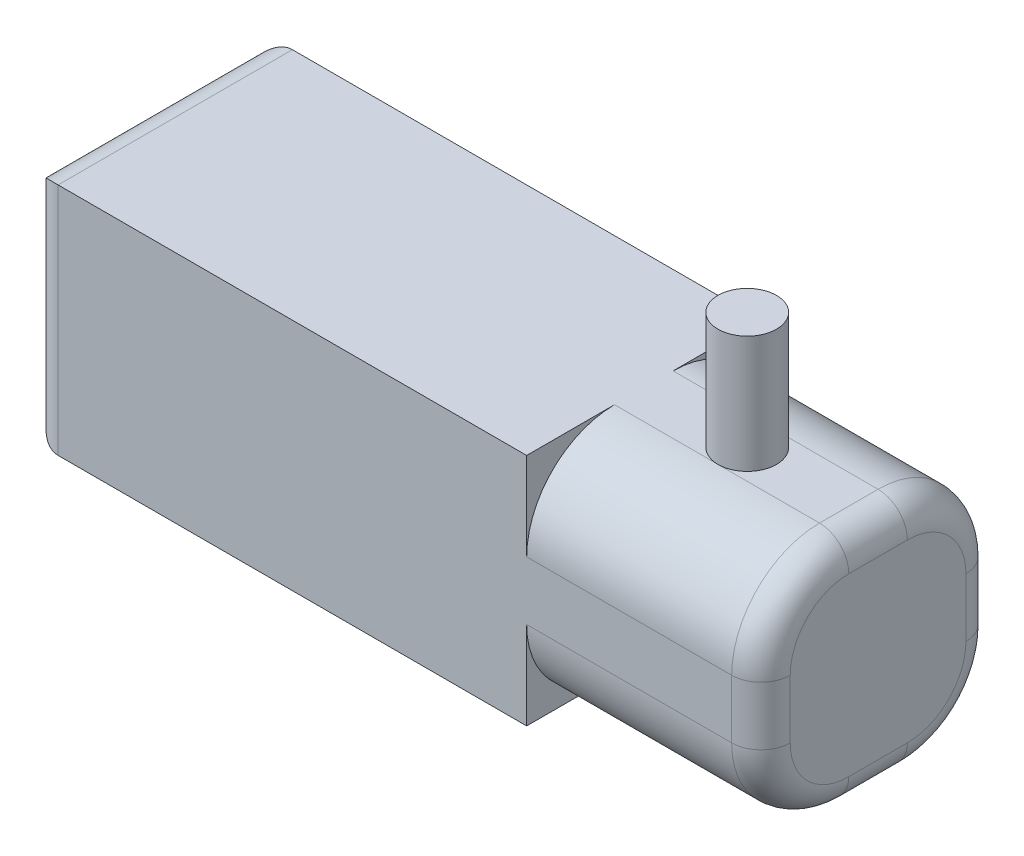
ISO-10303-21;
HEADER;
FILE_DESCRIPTION(('STEP AP214'),'2;1');
FILE_NAME('part.step','',(''),(''),'','','');
FILE_SCHEMA(('AUTOMOTIVE_DESIGN { 1 0 10303 214 1 1 1 1 }'));
ENDSEC;
DATA;
#1=APPLICATION_CONTEXT('core data for automotive mechanical design processes');
#2=APPLICATION_PROTOCOL_DEFINITION('international standard','automotive_design',2000,#1);
#3=PRODUCT_CONTEXT('',#1,'mechanical');
#4=PRODUCT('Part','Part','',(#3));
#5=PRODUCT_RELATED_PRODUCT_CATEGORY('part','',(#4));
#6=PRODUCT_DEFINITION_FORMATION('','',#4);
#7=PRODUCT_DEFINITION_CONTEXT('part definition',#1,'design');
#8=PRODUCT_DEFINITION('design','',#6,#7);
#9=PRODUCT_DEFINITION_SHAPE('','',#8);
#10=(LENGTH_UNIT() NAMED_UNIT(*) SI_UNIT(.MILLI.,.METRE.));
#11=(NAMED_UNIT(*) PLANE_ANGLE_UNIT() SI_UNIT($,.RADIAN.));
#12=(NAMED_UNIT(*) SI_UNIT($,.STERADIAN.) SOLID_ANGLE_UNIT());
#13=UNCERTAINTY_MEASURE_WITH_UNIT(LENGTH_MEASURE(1.E-05),#10,'distance_accuracy_value','');
#14=(GEOMETRIC_REPRESENTATION_CONTEXT(3) GLOBAL_UNCERTAINTY_ASSIGNED_CONTEXT((#13)) GLOBAL_UNIT_ASSIGNED_CONTEXT((#10,
#11,#12)) REPRESENTATION_CONTEXT('',''));
#15=CARTESIAN_POINT('',(0.,0.,0.));
#16=DIRECTION('',(0.,0.,1.));
#17=DIRECTION('',(1.,0.,0.));
#18=AXIS2_PLACEMENT_3D('',#15,#16,#17);
#19=CARTESIAN_POINT('',(20.4017152995501,25.4,10.16));
#20=DIRECTION('',(0.,-1.,0.));
#21=DIRECTION('',(0.,0.,-1.));
#22=AXIS2_PLACEMENT_3D('',#19,#20,#21);
#23=CYLINDRICAL_SURFACE('',#22,2.53999999999995);
#24=CARTESIAN_POINT('',(20.4017152995501,10.16,10.16));
#25=DIRECTION('',(0.,1.,0.));
#26=DIRECTION('',(0.,0.,1.));
#27=AXIS2_PLACEMENT_3D('',#24,#25,#26);
#28=CIRCLE('',#27,2.53999999999995);
#29=CARTESIAN_POINT('',(20.4017152995501,10.16,12.6999999999999));
#30=VERTEX_POINT('',#29);
#31=CARTESIAN_POINT('',(20.4017152995501,10.16,7.62));
#32=VERTEX_POINT('',#31);
#33=EDGE_CURVE('E190',#30,#32,#28,.T.);
#34=ORIENTED_EDGE('',*,*,#33,.T.);
#35=EDGE_CURVE('E197',#32,#30,#28,.T.);
#36=ORIENTED_EDGE('',*,*,#35,.T.);
#37=EDGE_LOOP('',(#34,#36));
#38=FACE_BOUND('',#37,.T.);
#39=CARTESIAN_POINT('',(20.4017152995501,20.32,10.16));
#40=DIRECTION('',(0.,1.,0.));
#41=DIRECTION('',(0.,0.,1.));
#42=AXIS2_PLACEMENT_3D('',#39,#40,#41);
#43=CIRCLE('',#42,2.53999999999995);
#44=CARTESIAN_POINT('',(20.4017152995501,20.32,12.6999999999999));
#45=VERTEX_POINT('',#44);
#46=EDGE_CURVE('E210',#45,#45,#43,.T.);
#47=ORIENTED_EDGE('',*,*,#46,.F.);
#48=EDGE_LOOP('',(#47));
#49=FACE_BOUND('',#48,.T.);
#50=ADVANCED_FACE('F42',(#38,#49),#23,.T.);
#51=CARTESIAN_POINT('',(-31.75,10.16,20.32));
#52=DIRECTION('',(0.,-1.,0.));
#53=DIRECTION('',(0.,0.,-1.));
#54=AXIS2_PLACEMENT_3D('',#51,#52,#53);
#55=PLANE('',#54);
#56=DIRECTION('',(-1.,0.,0.));
#57=VECTOR('',#56,1.);
#58=CARTESIAN_POINT('',(-31.75,10.16,0.));
#59=LINE('',#58,#57);
#60=CARTESIAN_POINT('',(11.43,10.16,0.));
#61=VERTEX_POINT('',#60);
#62=CARTESIAN_POINT('',(-29.21,10.16,0.));
#63=VERTEX_POINT('',#62);
#64=EDGE_CURVE('E259',#61,#63,#59,.T.);
#65=ORIENTED_EDGE('',*,*,#64,.T.);
#66=DIRECTION('',(0.,0.,-1.));
#67=VECTOR('',#66,1.);
#68=CARTESIAN_POINT('',(-29.21,10.16,20.32));
#69=LINE('',#68,#67);
#70=CARTESIAN_POINT('',(-29.21,10.16,20.32));
#71=VERTEX_POINT('',#70);
#72=EDGE_CURVE('E328',#63,#71,#69,.F.);
#73=ORIENTED_EDGE('',*,*,#72,.T.);
#74=DIRECTION('',(-1.,0.,0.));
#75=VECTOR('',#74,1.);
#76=CARTESIAN_POINT('',(-31.75,10.16,20.32));
#77=LINE('',#76,#75);
#78=CARTESIAN_POINT('',(11.43,10.16,20.32));
#79=VERTEX_POINT('',#78);
#80=EDGE_CURVE('E261',#79,#71,#77,.T.);
#81=ORIENTED_EDGE('',*,*,#80,.F.);
#82=DIRECTION('',(0.,0.,1.));
#83=VECTOR('',#82,1.);
#84=CARTESIAN_POINT('',(11.43,10.16,20.32));
#85=LINE('',#84,#83);
#86=CARTESIAN_POINT('',(11.43,10.16,12.6999999999999));
#87=VERTEX_POINT('',#86);
#88=EDGE_CURVE('E250',#87,#79,#85,.T.);
#89=ORIENTED_EDGE('',*,*,#88,.F.);
#90=DIRECTION('',(1.,0.,0.));
#91=VECTOR('',#90,1.);
#92=CARTESIAN_POINT('',(11.43,10.16,12.6999999999999));
#93=LINE('',#92,#91);
#94=EDGE_CURVE('E201',#87,#30,#93,.T.);
#95=ORIENTED_EDGE('',*,*,#94,.T.);
#96=ORIENTED_EDGE('',*,*,#35,.F.);
#97=DIRECTION('',(1.,0.,0.));
#98=VECTOR('',#97,1.);
#99=CARTESIAN_POINT('',(11.43,10.16,7.62000000000005));
#100=LINE('',#99,#98);
#101=CARTESIAN_POINT('',(11.43,10.16,7.62000000000005));
#102=VERTEX_POINT('',#101);
#103=EDGE_CURVE('E173',#102,#32,#100,.T.);
#104=ORIENTED_EDGE('',*,*,#103,.F.);
#105=DIRECTION('',(0.,0.,1.));
#106=VECTOR('',#105,1.);
#107=CARTESIAN_POINT('',(11.43,10.16,7.62000000000005));
#108=LINE('',#107,#106);
#109=EDGE_CURVE('E215',#61,#102,#108,.T.);
#110=ORIENTED_EDGE('',*,*,#109,.F.);
#111=EDGE_LOOP('',(#65,#73,#81,#89,#95,#96,#104,#110));
#112=FACE_BOUND('',#111,.T.);
#113=ADVANCED_FACE('F199',(#112),#55,.F.);
#114=ORIENTED_EDGE('',*,*,#33,.F.);
#115=CARTESIAN_POINT('',(29.21,10.16,12.6999999999999));
#116=VERTEX_POINT('',#115);
#117=EDGE_CURVE('E255',#30,#116,#93,.T.);
#118=ORIENTED_EDGE('',*,*,#117,.T.);
#119=DIRECTION('',(0.,0.,-1.));
#120=VECTOR('',#119,1.);
#121=CARTESIAN_POINT('',(29.21,10.16,20.32));
#122=LINE('',#121,#120);
#123=CARTESIAN_POINT('',(29.21,10.16,7.62000000000005));
#124=VERTEX_POINT('',#123);
#125=EDGE_CURVE('E193',#116,#124,#122,.T.);
#126=ORIENTED_EDGE('',*,*,#125,.T.);
#127=EDGE_CURVE('E176',#32,#124,#100,.T.);
#128=ORIENTED_EDGE('',*,*,#127,.F.);
#129=EDGE_LOOP('',(#114,#118,#126,#128));
#130=FACE_BOUND('',#129,.T.);
#131=ADVANCED_FACE('F188',(#130),#55,.F.);
#132=CARTESIAN_POINT('',(-31.75,-10.16,20.32));
#133=DIRECTION('',(0.,1.,0.));
#134=DIRECTION('',(0.,0.,1.));
#135=AXIS2_PLACEMENT_3D('',#132,#133,#134);
#136=PLANE('',#135);
#137=DIRECTION('',(1.,0.,0.));
#138=VECTOR('',#137,1.);
#139=CARTESIAN_POINT('',(-31.75,-10.16,20.32));
#140=LINE('',#139,#138);
#141=CARTESIAN_POINT('',(-29.21,-10.16,20.32));
#142=VERTEX_POINT('',#141);
#143=CARTESIAN_POINT('',(11.43,-10.16,20.32));
#144=VERTEX_POINT('',#143);
#145=EDGE_CURVE('E263',#142,#144,#140,.T.);
#146=ORIENTED_EDGE('',*,*,#145,.F.);
#147=DIRECTION('',(0.,0.,-1.));
#148=VECTOR('',#147,1.);
#149=CARTESIAN_POINT('',(-29.21,-10.16,20.32));
#150=LINE('',#149,#148);
#151=CARTESIAN_POINT('',(-29.21,-10.16,0.));
#152=VERTEX_POINT('',#151);
#153=EDGE_CURVE('E51',#142,#152,#150,.T.);
#154=ORIENTED_EDGE('',*,*,#153,.T.);
#155=DIRECTION('',(1.,0.,0.));
#156=VECTOR('',#155,1.);
#157=CARTESIAN_POINT('',(-31.75,-10.16,0.));
#158=LINE('',#157,#156);
#159=CARTESIAN_POINT('',(11.43,-10.16,0.));
#160=VERTEX_POINT('',#159);
#161=EDGE_CURVE('E264',#152,#160,#158,.T.);
#162=ORIENTED_EDGE('',*,*,#161,.T.);
#163=DIRECTION('',(0.,0.,-1.));
#164=VECTOR('',#163,1.);
#165=CARTESIAN_POINT('',(11.43,-10.16,7.62000000000005));
#166=LINE('',#165,#164);
#167=CARTESIAN_POINT('',(11.43,-10.16,7.62000000000005));
#168=VERTEX_POINT('',#167);
#169=EDGE_CURVE('E222',#168,#160,#166,.T.);
#170=ORIENTED_EDGE('',*,*,#169,.F.);
#171=DIRECTION('',(1.,0.,0.));
#172=VECTOR('',#171,1.);
#173=CARTESIAN_POINT('',(11.43,-10.16,7.62000000000005));
#174=LINE('',#173,#172);
#175=CARTESIAN_POINT('',(29.21,-10.16,7.62000000000005));
#176=VERTEX_POINT('',#175);
#177=EDGE_CURVE('E229',#168,#176,#174,.T.);
#178=ORIENTED_EDGE('',*,*,#177,.T.);
#179=DIRECTION('',(0.,0.,-1.));
#180=VECTOR('',#179,1.);
#181=CARTESIAN_POINT('',(29.21,-10.16,20.32));
#182=LINE('',#181,#180);
#183=CARTESIAN_POINT('',(29.21,-10.16,12.6999999999999));
#184=VERTEX_POINT('',#183);
#185=EDGE_CURVE('E293',#176,#184,#182,.F.);
#186=ORIENTED_EDGE('',*,*,#185,.T.);
#187=DIRECTION('',(1.,0.,0.));
#188=VECTOR('',#187,1.);
#189=CARTESIAN_POINT('',(11.43,-10.16,12.6999999999999));
#190=LINE('',#189,#188);
#191=CARTESIAN_POINT('',(11.43,-10.16,12.6999999999999));
#192=VERTEX_POINT('',#191);
#193=EDGE_CURVE('E223',#192,#184,#190,.T.);
#194=ORIENTED_EDGE('',*,*,#193,.F.);
#195=DIRECTION('',(0.,0.,-1.));
#196=VECTOR('',#195,1.);
#197=CARTESIAN_POINT('',(11.43,-10.16,12.6999999999999));
#198=LINE('',#197,#196);
#199=EDGE_CURVE('E240',#144,#192,#198,.T.);
#200=ORIENTED_EDGE('',*,*,#199,.F.);
#201=EDGE_LOOP('',(#146,#154,#162,#170,#178,#186,#194,#200));
#202=FACE_BOUND('',#201,.T.);
#203=ADVANCED_FACE('F418',(#202),#136,.F.);
#204=CARTESIAN_POINT('',(0.,0.,20.32));
#205=DIRECTION('',(0.,0.,-1.));
#206=DIRECTION('',(-1.,0.,0.));
#207=AXIS2_PLACEMENT_3D('',#204,#205,#206);
#208=PLANE('',#207);
#209=ORIENTED_EDGE('',*,*,#80,.T.);
#210=DIRECTION('',(0.,-1.,0.));
#211=VECTOR('',#210,1.);
#212=CARTESIAN_POINT('',(-29.21,0.,20.32));
#213=LINE('',#212,#211);
#214=EDGE_CURVE('E66',#71,#142,#213,.T.);
#215=ORIENTED_EDGE('',*,*,#214,.T.);
#216=ORIENTED_EDGE('',*,*,#145,.T.);
#217=DIRECTION('',(0.,-1.,0.));
#218=VECTOR('',#217,1.);
#219=CARTESIAN_POINT('',(11.43,-10.16,20.32));
#220=LINE('',#219,#218);
#221=CARTESIAN_POINT('',(11.43,-2.53999999999995,20.32));
#222=VERTEX_POINT('',#221);
#223=EDGE_CURVE('E236',#222,#144,#220,.T.);
#224=ORIENTED_EDGE('',*,*,#223,.F.);
#225=DIRECTION('',(1.,0.,0.));
#226=VECTOR('',#225,1.);
#227=CARTESIAN_POINT('',(11.43,-2.53999999999995,20.32));
#228=LINE('',#227,#226);
#229=CARTESIAN_POINT('',(29.21,-2.53999999999995,20.32));
#230=VERTEX_POINT('',#229);
#231=EDGE_CURVE('E243',#222,#230,#228,.T.);
#232=ORIENTED_EDGE('',*,*,#231,.T.);
#233=DIRECTION('',(0.,1.,0.));
#234=VECTOR('',#233,1.);
#235=CARTESIAN_POINT('',(29.21,0.,20.32));
#236=LINE('',#235,#234);
#237=CARTESIAN_POINT('',(29.21,2.53999999999995,20.32));
#238=VERTEX_POINT('',#237);
#239=EDGE_CURVE('E289',#230,#238,#236,.T.);
#240=ORIENTED_EDGE('',*,*,#239,.T.);
#241=DIRECTION('',(1.,0.,0.));
#242=VECTOR('',#241,1.);
#243=CARTESIAN_POINT('',(11.43,2.53999999999995,20.32));
#244=LINE('',#243,#242);
#245=CARTESIAN_POINT('',(11.43,2.53999999999995,20.32));
#246=VERTEX_POINT('',#245);
#247=EDGE_CURVE('E256',#246,#238,#244,.T.);
#248=ORIENTED_EDGE('',*,*,#247,.F.);
#249=DIRECTION('',(0.,-1.,0.));
#250=VECTOR('',#249,1.);
#251=CARTESIAN_POINT('',(11.43,2.53999999999995,20.32));
#252=LINE('',#251,#250);
#253=EDGE_CURVE('E252',#79,#246,#252,.T.);
#254=ORIENTED_EDGE('',*,*,#253,.F.);
#255=EDGE_LOOP('',(#209,#215,#216,#224,#232,#240,#248,#254));
#256=FACE_BOUND('',#255,.T.);
#257=ADVANCED_FACE('F415',(#256),#208,.F.);
#258=CARTESIAN_POINT('',(0.,0.,0.));
#259=DIRECTION('',(0.,0.,-1.));
#260=DIRECTION('',(-1.,0.,0.));
#261=AXIS2_PLACEMENT_3D('',#258,#259,#260);
#262=PLANE('',#261);
#263=ORIENTED_EDGE('',*,*,#161,.F.);
#264=DIRECTION('',(0.,-1.,0.));
#265=VECTOR('',#264,1.);
#266=CARTESIAN_POINT('',(-29.21,10.16,0.));
#267=LINE('',#266,#265);
#268=EDGE_CURVE('E11',#152,#63,#267,.F.);
#269=ORIENTED_EDGE('',*,*,#268,.T.);
#270=ORIENTED_EDGE('',*,*,#64,.F.);
#271=DIRECTION('',(0.,1.,0.));
#272=VECTOR('',#271,1.);
#273=CARTESIAN_POINT('',(11.43,10.16,0.));
#274=LINE('',#273,#272);
#275=CARTESIAN_POINT('',(11.43,2.53999999999995,0.));
#276=VERTEX_POINT('',#275);
#277=EDGE_CURVE('E212',#276,#61,#274,.T.);
#278=ORIENTED_EDGE('',*,*,#277,.F.);
#279=DIRECTION('',(1.,0.,0.));
#280=VECTOR('',#279,1.);
#281=CARTESIAN_POINT('',(11.43,2.53999999999995,0.));
#282=LINE('',#281,#280);
#283=CARTESIAN_POINT('',(29.21,2.53999999999995,0.));
#284=VERTEX_POINT('',#283);
#285=EDGE_CURVE('E194',#276,#284,#282,.T.);
#286=ORIENTED_EDGE('',*,*,#285,.T.);
#287=DIRECTION('',(0.,1.,0.));
#288=VECTOR('',#287,1.);
#289=CARTESIAN_POINT('',(29.21,-2.53999999999995,0.));
#290=LINE('',#289,#288);
#291=CARTESIAN_POINT('',(29.21,-2.53999999999995,0.));
#292=VERTEX_POINT('',#291);
#293=EDGE_CURVE('E297',#284,#292,#290,.F.);
#294=ORIENTED_EDGE('',*,*,#293,.T.);
#295=DIRECTION('',(1.,0.,0.));
#296=VECTOR('',#295,1.);
#297=CARTESIAN_POINT('',(11.43,-2.53999999999995,0.));
#298=LINE('',#297,#296);
#299=CARTESIAN_POINT('',(11.43,-2.53999999999995,0.));
#300=VERTEX_POINT('',#299);
#301=EDGE_CURVE('E213',#300,#292,#298,.T.);
#302=ORIENTED_EDGE('',*,*,#301,.F.);
#303=DIRECTION('',(0.,1.,0.));
#304=VECTOR('',#303,1.);
#305=CARTESIAN_POINT('',(11.43,-10.16,0.));
#306=LINE('',#305,#304);
#307=EDGE_CURVE('E226',#160,#300,#306,.T.);
#308=ORIENTED_EDGE('',*,*,#307,.F.);
#309=EDGE_LOOP('',(#263,#269,#270,#278,#286,#294,#302,#308));
#310=FACE_BOUND('',#309,.T.);
#311=ADVANCED_FACE('F354',(#310),#262,.T.);
#312=CARTESIAN_POINT('',(31.75,-10.16,20.32));
#313=DIRECTION('',(-1.,0.,0.));
#314=DIRECTION('',(0.,0.,1.));
#315=AXIS2_PLACEMENT_3D('',#312,#313,#314);
#316=PLANE('',#315);
#317=CARTESIAN_POINT('',(31.75,2.54,7.62));
#318=DIRECTION('',(-1.,0.,0.));
#319=DIRECTION('',(0.,0.,1.));
#320=AXIS2_PLACEMENT_3D('',#317,#318,#319);
#321=CIRCLE('',#320,5.08);
#322=CARTESIAN_POINT('',(31.75,2.53999999999995,2.54));
#323=VERTEX_POINT('',#322);
#324=CARTESIAN_POINT('',(31.75,7.62,7.62000000000005));
#325=VERTEX_POINT('',#324);
#326=EDGE_CURVE('E269',#323,#325,#321,.F.);
#327=ORIENTED_EDGE('',*,*,#326,.T.);
#328=DIRECTION('',(0.,0.,-1.));
#329=VECTOR('',#328,1.);
#330=CARTESIAN_POINT('',(31.75,7.62,20.32));
#331=LINE('',#330,#329);
#332=CARTESIAN_POINT('',(31.75,7.62,12.6999999999999));
#333=VERTEX_POINT('',#332);
#334=EDGE_CURVE('E283',#325,#333,#331,.F.);
#335=ORIENTED_EDGE('',*,*,#334,.T.);
#336=CARTESIAN_POINT('',(31.75,2.54,12.7));
#337=DIRECTION('',(-1.,0.,0.));
#338=DIRECTION('',(0.,0.,1.));
#339=AXIS2_PLACEMENT_3D('',#336,#337,#338);
#340=CIRCLE('',#339,5.08);
#341=CARTESIAN_POINT('',(31.75,2.53999999999996,17.78));
#342=VERTEX_POINT('',#341);
#343=EDGE_CURVE('E281',#333,#342,#340,.F.);
#344=ORIENTED_EDGE('',*,*,#343,.T.);
#345=DIRECTION('',(0.,1.,0.));
#346=VECTOR('',#345,1.);
#347=CARTESIAN_POINT('',(31.75,-10.16,17.78));
#348=LINE('',#347,#346);
#349=CARTESIAN_POINT('',(31.75,-2.53999999999995,17.78));
#350=VERTEX_POINT('',#349);
#351=EDGE_CURVE('E279',#342,#350,#348,.F.);
#352=ORIENTED_EDGE('',*,*,#351,.T.);
#353=CARTESIAN_POINT('',(31.75,-2.54,12.7));
#354=DIRECTION('',(-1.,0.,0.));
#355=DIRECTION('',(0.,0.,1.));
#356=AXIS2_PLACEMENT_3D('',#353,#354,#355);
#357=CIRCLE('',#356,5.08);
#358=CARTESIAN_POINT('',(31.75,-7.62,12.7));
#359=VERTEX_POINT('',#358);
#360=EDGE_CURVE('E277',#350,#359,#357,.F.);
#361=ORIENTED_EDGE('',*,*,#360,.T.);
#362=DIRECTION('',(0.,0.,-1.));
#363=VECTOR('',#362,1.);
#364=CARTESIAN_POINT('',(31.75,-7.62,20.32));
#365=LINE('',#364,#363);
#366=CARTESIAN_POINT('',(31.75,-7.62,7.62000000000005));
#367=VERTEX_POINT('',#366);
#368=EDGE_CURVE('E275',#359,#367,#365,.T.);
#369=ORIENTED_EDGE('',*,*,#368,.T.);
#370=CARTESIAN_POINT('',(31.75,-2.54,7.62));
#371=DIRECTION('',(-1.,0.,0.));
#372=DIRECTION('',(0.,0.,1.));
#373=AXIS2_PLACEMENT_3D('',#370,#371,#372);
#374=CIRCLE('',#373,5.08);
#375=CARTESIAN_POINT('',(31.75,-2.53999999999997,2.54));
#376=VERTEX_POINT('',#375);
#377=EDGE_CURVE('E273',#367,#376,#374,.F.);
#378=ORIENTED_EDGE('',*,*,#377,.T.);
#379=DIRECTION('',(0.,1.,0.));
#380=VECTOR('',#379,1.);
#381=CARTESIAN_POINT('',(31.75,2.53999999999994,2.54));
#382=LINE('',#381,#380);
#383=EDGE_CURVE('E271',#376,#323,#382,.T.);
#384=ORIENTED_EDGE('',*,*,#383,.T.);
#385=EDGE_LOOP('',(#327,#335,#344,#352,#361,#369,#378,#384));
#386=FACE_BOUND('',#385,.T.);
#387=ADVANCED_FACE('F365',(#386),#316,.F.);
#388=CARTESIAN_POINT('',(-31.75,-10.16,20.32));
#389=DIRECTION('',(1.,0.,0.));
#390=DIRECTION('',(0.,0.,-1.));
#391=AXIS2_PLACEMENT_3D('',#388,#389,#390);
#392=PLANE('',#391);
#393=DIRECTION('',(0.,-1.,0.));
#394=VECTOR('',#393,1.);
#395=CARTESIAN_POINT('',(-31.75,-10.16,17.78));
#396=LINE('',#395,#394);
#397=CARTESIAN_POINT('',(-31.75,-7.62,17.78));
#398=VERTEX_POINT('',#397);
#399=CARTESIAN_POINT('',(-31.75,7.62,17.78));
#400=VERTEX_POINT('',#399);
#401=EDGE_CURVE('E323',#398,#400,#396,.F.);
#402=ORIENTED_EDGE('',*,*,#401,.T.);
#403=DIRECTION('',(0.,0.,-1.));
#404=VECTOR('',#403,1.);
#405=CARTESIAN_POINT('',(-31.75,7.62,20.32));
#406=LINE('',#405,#404);
#407=CARTESIAN_POINT('',(-31.75,7.62,2.54));
#408=VERTEX_POINT('',#407);
#409=EDGE_CURVE('E325',#400,#408,#406,.T.);
#410=ORIENTED_EDGE('',*,*,#409,.T.);
#411=DIRECTION('',(0.,-1.,0.));
#412=VECTOR('',#411,1.);
#413=CARTESIAN_POINT('',(-31.75,-10.16,2.54));
#414=LINE('',#413,#412);
#415=CARTESIAN_POINT('',(-31.75,-7.62,2.54));
#416=VERTEX_POINT('',#415);
#417=EDGE_CURVE('E300',#408,#416,#414,.T.);
#418=ORIENTED_EDGE('',*,*,#417,.T.);
#419=DIRECTION('',(0.,0.,-1.));
#420=VECTOR('',#419,1.);
#421=CARTESIAN_POINT('',(-31.75,-7.62,20.32));
#422=LINE('',#421,#420);
#423=EDGE_CURVE('E321',#416,#398,#422,.F.);
#424=ORIENTED_EDGE('',*,*,#423,.T.);
#425=EDGE_LOOP('',(#402,#410,#418,#424));
#426=FACE_BOUND('',#425,.T.);
#427=ADVANCED_FACE('F363',(#426),#392,.F.);
#428=CARTESIAN_POINT('',(11.43,2.54,7.62));
#429=DIRECTION('',(1.,0.,0.));
#430=DIRECTION('',(0.,0.,-1.));
#431=AXIS2_PLACEMENT_3D('',#428,#429,#430);
#432=CYLINDRICAL_SURFACE('',#431,7.62);
#433=ORIENTED_EDGE('',*,*,#103,.T.);
#434=ORIENTED_EDGE('',*,*,#127,.T.);
#435=CARTESIAN_POINT('',(29.21,2.54,7.62));
#436=DIRECTION('',(-1.,0.,0.));
#437=DIRECTION('',(0.,0.,1.));
#438=AXIS2_PLACEMENT_3D('',#435,#436,#437);
#439=CIRCLE('',#438,7.62);
#440=EDGE_CURVE('E299',#124,#284,#439,.T.);
#441=ORIENTED_EDGE('',*,*,#440,.T.);
#442=ORIENTED_EDGE('',*,*,#285,.F.);
#443=CARTESIAN_POINT('',(11.43,2.54,7.62));
#444=DIRECTION('',(-1.,0.,0.));
#445=DIRECTION('',(0.,0.,1.));
#446=AXIS2_PLACEMENT_3D('',#443,#444,#445);
#447=CIRCLE('',#446,7.62);
#448=EDGE_CURVE('E179',#102,#276,#447,.T.);
#449=ORIENTED_EDGE('',*,*,#448,.F.);
#450=EDGE_LOOP('',(#433,#434,#441,#442,#449));
#451=FACE_BOUND('',#450,.T.);
#452=ADVANCED_FACE('F175',(#451),#432,.T.);
#453=CARTESIAN_POINT('',(11.43,2.54,7.62));
#454=DIRECTION('',(-1.,0.,0.));
#455=DIRECTION('',(0.,0.,1.));
#456=AXIS2_PLACEMENT_3D('',#453,#454,#455);
#457=PLANE('',#456);
#458=ORIENTED_EDGE('',*,*,#448,.T.);
#459=ORIENTED_EDGE('',*,*,#277,.T.);
#460=ORIENTED_EDGE('',*,*,#109,.T.);
#461=EDGE_LOOP('',(#458,#459,#460));
#462=FACE_BOUND('',#461,.T.);
#463=ADVANCED_FACE('F371',(#462),#457,.F.);
#464=CARTESIAN_POINT('',(11.43,-2.54,7.62));
#465=DIRECTION('',(1.,0.,0.));
#466=DIRECTION('',(0.,0.,-1.));
#467=AXIS2_PLACEMENT_3D('',#464,#465,#466);
#468=CYLINDRICAL_SURFACE('',#467,7.62);
#469=ORIENTED_EDGE('',*,*,#301,.T.);
#470=CARTESIAN_POINT('',(29.21,-2.54,7.62));
#471=DIRECTION('',(-1.,0.,0.));
#472=DIRECTION('',(0.,0.,1.));
#473=AXIS2_PLACEMENT_3D('',#470,#471,#472);
#474=CIRCLE('',#473,7.62);
#475=EDGE_CURVE('E295',#292,#176,#474,.T.);
#476=ORIENTED_EDGE('',*,*,#475,.T.);
#477=ORIENTED_EDGE('',*,*,#177,.F.);
#478=CARTESIAN_POINT('',(11.43,-2.54,7.62));
#479=DIRECTION('',(-1.,0.,0.));
#480=DIRECTION('',(0.,0.,-1.));
#481=AXIS2_PLACEMENT_3D('',#478,#479,#480);
#482=CIRCLE('',#481,7.62);
#483=EDGE_CURVE('E219',#300,#168,#482,.T.);
#484=ORIENTED_EDGE('',*,*,#483,.F.);
#485=EDGE_LOOP('',(#469,#476,#477,#484));
#486=FACE_BOUND('',#485,.T.);
#487=ADVANCED_FACE('F388',(#486),#468,.T.);
#488=CARTESIAN_POINT('',(11.43,-2.54,7.62));
#489=DIRECTION('',(1.,0.,0.));
#490=DIRECTION('',(0.,0.,-1.));
#491=AXIS2_PLACEMENT_3D('',#488,#489,#490);
#492=PLANE('',#491);
#493=ORIENTED_EDGE('',*,*,#483,.T.);
#494=ORIENTED_EDGE('',*,*,#169,.T.);
#495=ORIENTED_EDGE('',*,*,#307,.T.);
#496=EDGE_LOOP('',(#493,#494,#495));
#497=FACE_BOUND('',#496,.T.);
#498=ADVANCED_FACE('F391',(#497),#492,.T.);
#499=CARTESIAN_POINT('',(11.43,2.54,12.7));
#500=DIRECTION('',(1.,0.,0.));
#501=DIRECTION('',(0.,0.,-1.));
#502=AXIS2_PLACEMENT_3D('',#499,#500,#501);
#503=CYLINDRICAL_SURFACE('',#502,7.62);
#504=ORIENTED_EDGE('',*,*,#247,.T.);
#505=CARTESIAN_POINT('',(29.21,2.54,12.7));
#506=DIRECTION('',(-1.,0.,0.));
#507=DIRECTION('',(0.,0.,1.));
#508=AXIS2_PLACEMENT_3D('',#505,#506,#507);
#509=CIRCLE('',#508,7.62);
#510=EDGE_CURVE('E286',#238,#116,#509,.T.);
#511=ORIENTED_EDGE('',*,*,#510,.T.);
#512=ORIENTED_EDGE('',*,*,#117,.F.);
#513=ORIENTED_EDGE('',*,*,#94,.F.);
#514=CARTESIAN_POINT('',(11.43,2.54,12.7));
#515=DIRECTION('',(-1.,0.,0.));
#516=DIRECTION('',(0.,0.,-1.));
#517=AXIS2_PLACEMENT_3D('',#514,#515,#516);
#518=CIRCLE('',#517,7.62);
#519=EDGE_CURVE('E184',#246,#87,#518,.T.);
#520=ORIENTED_EDGE('',*,*,#519,.F.);
#521=EDGE_LOOP('',(#504,#511,#512,#513,#520));
#522=FACE_BOUND('',#521,.T.);
#523=ADVANCED_FACE('F394',(#522),#503,.T.);
#524=CARTESIAN_POINT('',(11.43,2.54,12.7));
#525=DIRECTION('',(1.,0.,0.));
#526=DIRECTION('',(0.,0.,-1.));
#527=AXIS2_PLACEMENT_3D('',#524,#525,#526);
#528=PLANE('',#527);
#529=ORIENTED_EDGE('',*,*,#519,.T.);
#530=ORIENTED_EDGE('',*,*,#88,.T.);
#531=ORIENTED_EDGE('',*,*,#253,.T.);
#532=EDGE_LOOP('',(#529,#530,#531));
#533=FACE_BOUND('',#532,.T.);
#534=ADVANCED_FACE('F407',(#533),#528,.T.);
#535=CARTESIAN_POINT('',(11.43,-2.54,12.7));
#536=DIRECTION('',(1.,0.,0.));
#537=DIRECTION('',(0.,0.,-1.));
#538=AXIS2_PLACEMENT_3D('',#535,#536,#537);
#539=CYLINDRICAL_SURFACE('',#538,7.62);
#540=ORIENTED_EDGE('',*,*,#193,.T.);
#541=CARTESIAN_POINT('',(29.21,-2.54,12.7));
#542=DIRECTION('',(-1.,0.,0.));
#543=DIRECTION('',(0.,0.,1.));
#544=AXIS2_PLACEMENT_3D('',#541,#542,#543);
#545=CIRCLE('',#544,7.62);
#546=EDGE_CURVE('E291',#184,#230,#545,.T.);
#547=ORIENTED_EDGE('',*,*,#546,.T.);
#548=ORIENTED_EDGE('',*,*,#231,.F.);
#549=CARTESIAN_POINT('',(11.43,-2.54,12.7));
#550=DIRECTION('',(-1.,0.,0.));
#551=DIRECTION('',(0.,0.,1.));
#552=AXIS2_PLACEMENT_3D('',#549,#550,#551);
#553=CIRCLE('',#552,7.62);
#554=EDGE_CURVE('E234',#192,#222,#553,.T.);
#555=ORIENTED_EDGE('',*,*,#554,.F.);
#556=EDGE_LOOP('',(#540,#547,#548,#555));
#557=FACE_BOUND('',#556,.T.);
#558=ADVANCED_FACE('F403',(#557),#539,.T.);
#559=CARTESIAN_POINT('',(11.43,-2.54,12.7));
#560=DIRECTION('',(-1.,0.,0.));
#561=DIRECTION('',(0.,0.,1.));
#562=AXIS2_PLACEMENT_3D('',#559,#560,#561);
#563=PLANE('',#562);
#564=ORIENTED_EDGE('',*,*,#554,.T.);
#565=ORIENTED_EDGE('',*,*,#223,.T.);
#566=ORIENTED_EDGE('',*,*,#199,.T.);
#567=EDGE_LOOP('',(#564,#565,#566));
#568=FACE_BOUND('',#567,.T.);
#569=ADVANCED_FACE('F399',(#568),#563,.F.);
#570=CARTESIAN_POINT('',(29.21,-7.62,20.32));
#571=DIRECTION('',(0.,0.,-1.));
#572=DIRECTION('',(-1.,0.,0.));
#573=AXIS2_PLACEMENT_3D('',#570,#571,#572);
#574=CYLINDRICAL_SURFACE('',#573,2.54);
#575=CARTESIAN_POINT('',(29.21,-7.62,7.62000000000005));
#576=DIRECTION('',(0.,0.,-1.));
#577=DIRECTION('',(-1.,0.,0.));
#578=AXIS2_PLACEMENT_3D('',#575,#576,#577);
#579=CIRCLE('',#578,2.54);
#580=EDGE_CURVE('E315',#367,#176,#579,.T.);
#581=ORIENTED_EDGE('',*,*,#580,.F.);
#582=ORIENTED_EDGE('',*,*,#368,.F.);
#583=CARTESIAN_POINT('',(29.21,-7.62,12.6999999999999));
#584=DIRECTION('',(0.,0.,1.));
#585=DIRECTION('',(1.,0.,0.));
#586=AXIS2_PLACEMENT_3D('',#583,#584,#585);
#587=CIRCLE('',#586,2.54);
#588=EDGE_CURVE('E237',#184,#359,#587,.T.);
#589=ORIENTED_EDGE('',*,*,#588,.F.);
#590=ORIENTED_EDGE('',*,*,#185,.F.);
#591=EDGE_LOOP('',(#581,#582,#589,#590));
#592=FACE_BOUND('',#591,.T.);
#593=ADVANCED_FACE('F402',(#592),#574,.T.);
#594=CARTESIAN_POINT('',(29.21,-2.54,12.7));
#595=DIRECTION('',(-1.,0.,0.));
#596=DIRECTION('',(0.,0.,1.));
#597=AXIS2_PLACEMENT_3D('',#594,#595,#596);
#598=TOROIDAL_SURFACE('',#597,5.08,2.54);
#599=ORIENTED_EDGE('',*,*,#588,.T.);
#600=ORIENTED_EDGE('',*,*,#360,.F.);
#601=CARTESIAN_POINT('',(29.21,-2.53999999999997,17.78));
#602=DIRECTION('',(0.,1.,0.));
#603=DIRECTION('',(0.,0.,1.));
#604=AXIS2_PLACEMENT_3D('',#601,#602,#603);
#605=CIRCLE('',#604,2.54);
#606=EDGE_CURVE('E312',#230,#350,#605,.T.);
#607=ORIENTED_EDGE('',*,*,#606,.F.);
#608=ORIENTED_EDGE('',*,*,#546,.F.);
#609=EDGE_LOOP('',(#599,#600,#607,#608));
#610=FACE_BOUND('',#609,.T.);
#611=ADVANCED_FACE('F434',(#610),#598,.T.);
#612=CARTESIAN_POINT('',(29.21,-2.54,7.62));
#613=DIRECTION('',(-1.,0.,0.));
#614=DIRECTION('',(0.,0.,1.));
#615=AXIS2_PLACEMENT_3D('',#612,#613,#614);
#616=TOROIDAL_SURFACE('',#615,5.08,2.54);
#617=ORIENTED_EDGE('',*,*,#580,.T.);
#618=ORIENTED_EDGE('',*,*,#475,.F.);
#619=CARTESIAN_POINT('',(29.21,-2.53999999999997,2.54));
#620=DIRECTION('',(0.,1.,0.));
#621=DIRECTION('',(0.,0.,1.));
#622=AXIS2_PLACEMENT_3D('',#619,#620,#621);
#623=CIRCLE('',#622,2.54);
#624=EDGE_CURVE('E309',#376,#292,#623,.T.);
#625=ORIENTED_EDGE('',*,*,#624,.F.);
#626=ORIENTED_EDGE('',*,*,#377,.F.);
#627=EDGE_LOOP('',(#617,#618,#625,#626));
#628=FACE_BOUND('',#627,.T.);
#629=ADVANCED_FACE('F463',(#628),#616,.T.);
#630=CARTESIAN_POINT('',(29.21,0.,17.78));
#631=DIRECTION('',(0.,1.,0.));
#632=DIRECTION('',(0.,0.,1.));
#633=AXIS2_PLACEMENT_3D('',#630,#631,#632);
#634=CYLINDRICAL_SURFACE('',#633,2.54);
#635=ORIENTED_EDGE('',*,*,#606,.T.);
#636=ORIENTED_EDGE('',*,*,#351,.F.);
#637=CARTESIAN_POINT('',(29.21,2.53999999999995,17.78));
#638=DIRECTION('',(0.,1.,0.));
#639=DIRECTION('',(-1.,0.,0.));
#640=AXIS2_PLACEMENT_3D('',#637,#638,#639);
#641=CIRCLE('',#640,2.54);
#642=EDGE_CURVE('E306',#238,#342,#641,.T.);
#643=ORIENTED_EDGE('',*,*,#642,.F.);
#644=ORIENTED_EDGE('',*,*,#239,.F.);
#645=EDGE_LOOP('',(#635,#636,#643,#644));
#646=FACE_BOUND('',#645,.T.);
#647=ADVANCED_FACE('F438',(#646),#634,.T.);
#648=CARTESIAN_POINT('',(29.21,-10.16,2.54));
#649=DIRECTION('',(0.,-1.,0.));
#650=DIRECTION('',(0.,0.,-1.));
#651=AXIS2_PLACEMENT_3D('',#648,#649,#650);
#652=CYLINDRICAL_SURFACE('',#651,2.54);
#653=ORIENTED_EDGE('',*,*,#624,.T.);
#654=ORIENTED_EDGE('',*,*,#293,.F.);
#655=CARTESIAN_POINT('',(29.21,2.53999999999995,2.54));
#656=DIRECTION('',(0.,1.,0.));
#657=DIRECTION('',(0.,0.,1.));
#658=AXIS2_PLACEMENT_3D('',#655,#656,#657);
#659=CIRCLE('',#658,2.54);
#660=EDGE_CURVE('E303',#323,#284,#659,.T.);
#661=ORIENTED_EDGE('',*,*,#660,.F.);
#662=ORIENTED_EDGE('',*,*,#383,.F.);
#663=EDGE_LOOP('',(#653,#654,#661,#662));
#664=FACE_BOUND('',#663,.T.);
#665=ADVANCED_FACE('F457',(#664),#652,.T.);
#666=CARTESIAN_POINT('',(29.21,2.54,12.7));
#667=DIRECTION('',(-1.,0.,0.));
#668=DIRECTION('',(0.,0.,1.));
#669=AXIS2_PLACEMENT_3D('',#666,#667,#668);
#670=TOROIDAL_SURFACE('',#669,5.08,2.54);
#671=ORIENTED_EDGE('',*,*,#642,.T.);
#672=ORIENTED_EDGE('',*,*,#343,.F.);
#673=CARTESIAN_POINT('',(29.21,7.62,12.7));
#674=DIRECTION('',(0.,0.,-1.));
#675=DIRECTION('',(0.,1.,0.));
#676=AXIS2_PLACEMENT_3D('',#673,#674,#675);
#677=CIRCLE('',#676,2.54);
#678=EDGE_CURVE('E206',#116,#333,#677,.T.);
#679=ORIENTED_EDGE('',*,*,#678,.F.);
#680=ORIENTED_EDGE('',*,*,#510,.F.);
#681=EDGE_LOOP('',(#671,#672,#679,#680));
#682=FACE_BOUND('',#681,.T.);
#683=ADVANCED_FACE('F443',(#682),#670,.T.);
#684=CARTESIAN_POINT('',(29.21,2.54,7.62));
#685=DIRECTION('',(-1.,0.,0.));
#686=DIRECTION('',(0.,0.,1.));
#687=AXIS2_PLACEMENT_3D('',#684,#685,#686);
#688=TOROIDAL_SURFACE('',#687,5.08,2.54);
#689=ORIENTED_EDGE('',*,*,#660,.T.);
#690=ORIENTED_EDGE('',*,*,#440,.F.);
#691=CARTESIAN_POINT('',(29.21,7.62,7.62000000000005));
#692=DIRECTION('',(0.,0.,1.));
#693=DIRECTION('',(1.,0.,0.));
#694=AXIS2_PLACEMENT_3D('',#691,#692,#693);
#695=CIRCLE('',#694,2.54);
#696=EDGE_CURVE('E205',#325,#124,#695,.T.);
#697=ORIENTED_EDGE('',*,*,#696,.F.);
#698=ORIENTED_EDGE('',*,*,#326,.F.);
#699=EDGE_LOOP('',(#689,#690,#697,#698));
#700=FACE_BOUND('',#699,.T.);
#701=ADVANCED_FACE('F452',(#700),#688,.T.);
#702=CARTESIAN_POINT('',(29.21,7.62,20.32));
#703=DIRECTION('',(0.,0.,-1.));
#704=DIRECTION('',(-1.,0.,0.));
#705=AXIS2_PLACEMENT_3D('',#702,#703,#704);
#706=CYLINDRICAL_SURFACE('',#705,2.54);
#707=ORIENTED_EDGE('',*,*,#678,.T.);
#708=ORIENTED_EDGE('',*,*,#334,.F.);
#709=ORIENTED_EDGE('',*,*,#696,.T.);
#710=ORIENTED_EDGE('',*,*,#125,.F.);
#711=EDGE_LOOP('',(#707,#708,#709,#710));
#712=FACE_BOUND('',#711,.T.);
#713=ADVANCED_FACE('F447',(#712),#706,.T.);
#714=CARTESIAN_POINT('',(-29.21,-7.62,20.32));
#715=DIRECTION('',(0.,0.,-1.));
#716=DIRECTION('',(-1.,0.,0.));
#717=AXIS2_PLACEMENT_3D('',#714,#715,#716);
#718=CYLINDRICAL_SURFACE('',#717,2.54);
#719=CARTESIAN_POINT('',(-29.21,-7.62,2.54));
#720=DIRECTION('',(0.,0.707106781186547,-0.707106781186547));
#721=DIRECTION('',(0.,0.707106781186547,0.707106781186547));
#722=AXIS2_PLACEMENT_3D('',#719,#720,#721);
#723=ELLIPSE('',#722,3.59210244842766,2.54);
#724=EDGE_CURVE('E336',#152,#416,#723,.T.);
#725=ORIENTED_EDGE('',*,*,#724,.F.);
#726=ORIENTED_EDGE('',*,*,#153,.F.);
#727=CARTESIAN_POINT('',(-29.21,-7.62,17.78));
#728=DIRECTION('',(0.,-0.707106781186547,-0.707106781186547));
#729=DIRECTION('',(0.,0.707106781186547,-0.707106781186547));
#730=AXIS2_PLACEMENT_3D('',#727,#728,#729);
#731=ELLIPSE('',#730,3.59210244842766,2.54);
#732=EDGE_CURVE('E46',#398,#142,#731,.F.);
#733=ORIENTED_EDGE('',*,*,#732,.F.);
#734=ORIENTED_EDGE('',*,*,#423,.F.);
#735=EDGE_LOOP('',(#725,#726,#733,#734));
#736=FACE_BOUND('',#735,.T.);
#737=ADVANCED_FACE('F44',(#736),#718,.T.);
#738=CARTESIAN_POINT('',(-29.21,0.,17.78));
#739=DIRECTION('',(0.,-1.,0.));
#740=DIRECTION('',(0.,0.,-1.));
#741=AXIS2_PLACEMENT_3D('',#738,#739,#740);
#742=CYLINDRICAL_SURFACE('',#741,2.54);
#743=ORIENTED_EDGE('',*,*,#732,.T.);
#744=ORIENTED_EDGE('',*,*,#214,.F.);
#745=CARTESIAN_POINT('',(-29.21,7.62,17.78));
#746=DIRECTION('',(0.,-0.707106781186547,0.707106781186547));
#747=DIRECTION('',(0.,-0.707106781186547,-0.707106781186547));
#748=AXIS2_PLACEMENT_3D('',#745,#746,#747);
#749=ELLIPSE('',#748,3.59210244842766,2.54);
#750=EDGE_CURVE('E335',#400,#71,#749,.F.);
#751=ORIENTED_EDGE('',*,*,#750,.F.);
#752=ORIENTED_EDGE('',*,*,#401,.F.);
#753=EDGE_LOOP('',(#743,#744,#751,#752));
#754=FACE_BOUND('',#753,.T.);
#755=ADVANCED_FACE('F346',(#754),#742,.T.);
#756=CARTESIAN_POINT('',(-29.21,-10.16,2.54));
#757=DIRECTION('',(0.,1.,0.));
#758=DIRECTION('',(0.,0.,1.));
#759=AXIS2_PLACEMENT_3D('',#756,#757,#758);
#760=CYLINDRICAL_SURFACE('',#759,2.54);
#761=ORIENTED_EDGE('',*,*,#724,.T.);
#762=ORIENTED_EDGE('',*,*,#417,.F.);
#763=CARTESIAN_POINT('',(-29.21,7.62,2.54));
#764=DIRECTION('',(0.,0.707106781186547,0.707106781186547));
#765=DIRECTION('',(0.,0.707106781186547,-0.707106781186547));
#766=AXIS2_PLACEMENT_3D('',#763,#764,#765);
#767=ELLIPSE('',#766,3.59210244842766,2.54);
#768=EDGE_CURVE('E333',#63,#408,#767,.T.);
#769=ORIENTED_EDGE('',*,*,#768,.F.);
#770=ORIENTED_EDGE('',*,*,#268,.F.);
#771=EDGE_LOOP('',(#761,#762,#769,#770));
#772=FACE_BOUND('',#771,.T.);
#773=ADVANCED_FACE('F351',(#772),#760,.T.);
#774=CARTESIAN_POINT('',(-29.21,7.62,20.32));
#775=DIRECTION('',(0.,0.,-1.));
#776=DIRECTION('',(-1.,0.,0.));
#777=AXIS2_PLACEMENT_3D('',#774,#775,#776);
#778=CYLINDRICAL_SURFACE('',#777,2.54);
#779=ORIENTED_EDGE('',*,*,#750,.T.);
#780=ORIENTED_EDGE('',*,*,#72,.F.);
#781=ORIENTED_EDGE('',*,*,#768,.T.);
#782=ORIENTED_EDGE('',*,*,#409,.F.);
#783=EDGE_LOOP('',(#779,#780,#781,#782));
#784=FACE_BOUND('',#783,.T.);
#785=ADVANCED_FACE('F360',(#784),#778,.T.);
#786=CARTESIAN_POINT('',(20.4017152995501,20.32,10.16));
#787=DIRECTION('',(0.,1.,0.));
#788=DIRECTION('',(0.,0.,1.));
#789=AXIS2_PLACEMENT_3D('',#786,#787,#788);
#790=PLANE('',#789);
#791=ORIENTED_EDGE('',*,*,#46,.T.);
#792=EDGE_LOOP('',(#791));
#793=FACE_BOUND('',#792,.T.);
#794=ADVANCED_FACE('F386',(#793),#790,.T.);
#795=CLOSED_SHELL('',(#50,#113,#131,#203,#257,#311,#387,#427,#452,#463,#487,#498,#523,#534,#558,
#569,#593,#611,#629,#647,#665,#683,#701,#713,#737,#755,#773,#785,#794));
#796=MANIFOLD_SOLID_BREP('B2',#795);
#797=ADVANCED_BREP_SHAPE_REPRESENTATION('',(#18,#796),#14);
#798=SHAPE_DEFINITION_REPRESENTATION(#9,#797);
ENDSEC;
END-ISO-10303-21;
